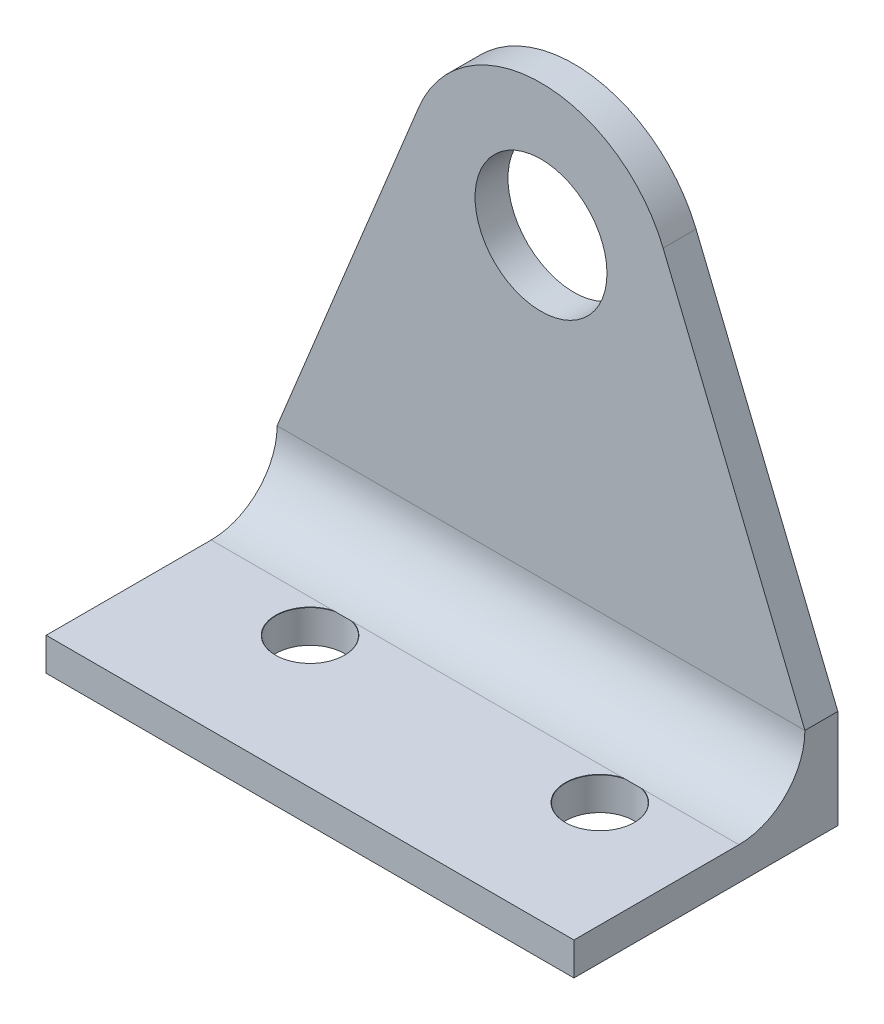
ISO-10303-21;
HEADER;
FILE_DESCRIPTION(('STEP AP214'),'2;1');
FILE_NAME('part.step','',(''),(''),'','','');
FILE_SCHEMA(('AUTOMOTIVE_DESIGN { 1 0 10303 214 1 1 1 1 }'));
ENDSEC;
DATA;
#1=APPLICATION_CONTEXT('core data for automotive mechanical design processes');
#2=APPLICATION_PROTOCOL_DEFINITION('international standard','automotive_design',2000,#1);
#3=PRODUCT_CONTEXT('',#1,'mechanical');
#4=PRODUCT('Part','Part','',(#3));
#5=PRODUCT_RELATED_PRODUCT_CATEGORY('part','',(#4));
#6=PRODUCT_DEFINITION_FORMATION('','',#4);
#7=PRODUCT_DEFINITION_CONTEXT('part definition',#1,'design');
#8=PRODUCT_DEFINITION('design','',#6,#7);
#9=PRODUCT_DEFINITION_SHAPE('','',#8);
#10=(LENGTH_UNIT() NAMED_UNIT(*) SI_UNIT(.MILLI.,.METRE.));
#11=(NAMED_UNIT(*) PLANE_ANGLE_UNIT() SI_UNIT($,.RADIAN.));
#12=(NAMED_UNIT(*) SI_UNIT($,.STERADIAN.) SOLID_ANGLE_UNIT());
#13=UNCERTAINTY_MEASURE_WITH_UNIT(LENGTH_MEASURE(1.E-05),#10,'distance_accuracy_value','');
#14=(GEOMETRIC_REPRESENTATION_CONTEXT(3) GLOBAL_UNCERTAINTY_ASSIGNED_CONTEXT((#13)) GLOBAL_UNIT_ASSIGNED_CONTEXT((#10,
#11,#12)) REPRESENTATION_CONTEXT('',''));
#15=CARTESIAN_POINT('',(0.,0.,0.));
#16=DIRECTION('',(0.,0.,1.));
#17=DIRECTION('',(1.,0.,0.));
#18=AXIS2_PLACEMENT_3D('',#15,#16,#17);
#19=CARTESIAN_POINT('',(25.4,-3.17,-25.4));
#20=DIRECTION('',(0.,0.,1.));
#21=DIRECTION('',(1.,0.,0.));
#22=AXIS2_PLACEMENT_3D('',#19,#20,#21);
#23=PLANE('',#22);
#24=CARTESIAN_POINT('',(0.,34.93,-25.4));
#25=DIRECTION('',(0.,0.,1.));
#26=DIRECTION('',(1.,0.,0.));
#27=AXIS2_PLACEMENT_3D('',#24,#25,#26);
#28=CIRCLE('',#27,6.35);
#29=CARTESIAN_POINT('',(6.35,34.93,-25.4));
#30=VERTEX_POINT('',#29);
#31=EDGE_CURVE('E291',#30,#30,#28,.T.);
#32=ORIENTED_EDGE('',*,*,#31,.T.);
#33=EDGE_LOOP('',(#32));
#34=FACE_BOUND('',#33,.T.);
#35=DIRECTION('',(0.378313744263215,0.925677433505618,0.));
#36=VECTOR('',#35,1.);
#37=CARTESIAN_POINT('',(-23.9884670055434,9.80381118035179,-25.4));
#38=LINE('',#37,#36);
#39=CARTESIAN_POINT('',(-25.4,6.35,-25.4));
#40=VERTEX_POINT('',#39);
#41=CARTESIAN_POINT('',(-11.7561034055213,39.7345845521428,-25.4));
#42=VERTEX_POINT('',#41);
#43=EDGE_CURVE('E173',#40,#42,#38,.T.);
#44=ORIENTED_EDGE('',*,*,#43,.T.);
#45=CARTESIAN_POINT('',(0.,34.93,-25.4));
#46=DIRECTION('',(0.,0.,1.));
#47=DIRECTION('',(1.,0.,0.));
#48=AXIS2_PLACEMENT_3D('',#45,#46,#47);
#49=CIRCLE('',#48,12.7);
#50=CARTESIAN_POINT('',(11.7561034055213,39.7345845521428,-25.4));
#51=VERTEX_POINT('',#50);
#52=EDGE_CURVE('E307',#51,#42,#49,.T.);
#53=ORIENTED_EDGE('',*,*,#52,.F.);
#54=DIRECTION('',(-0.378313744263215,0.925677433505618,0.));
#55=VECTOR('',#54,1.);
#56=CARTESIAN_POINT('',(23.9884670055434,9.8038111803518,-25.4));
#57=LINE('',#56,#55);
#58=CARTESIAN_POINT('',(25.4,6.35,-25.4));
#59=VERTEX_POINT('',#58);
#60=EDGE_CURVE('E299',#59,#51,#57,.T.);
#61=ORIENTED_EDGE('',*,*,#60,.F.);
#62=DIRECTION('',(0.,1.,0.));
#63=VECTOR('',#62,1.);
#64=CARTESIAN_POINT('',(25.4,-3.17,-25.4));
#65=LINE('',#64,#63);
#66=CARTESIAN_POINT('',(25.4,-3.17,-25.4));
#67=VERTEX_POINT('',#66);
#68=EDGE_CURVE('E243',#67,#59,#65,.T.);
#69=ORIENTED_EDGE('',*,*,#68,.F.);
#70=DIRECTION('',(-1.,0.,0.));
#71=VECTOR('',#70,1.);
#72=CARTESIAN_POINT('',(25.4,-3.17,-25.4));
#73=LINE('',#72,#71);
#74=CARTESIAN_POINT('',(-25.4,-3.17,-25.4));
#75=VERTEX_POINT('',#74);
#76=EDGE_CURVE('E200',#67,#75,#73,.T.);
#77=ORIENTED_EDGE('',*,*,#76,.T.);
#78=DIRECTION('',(0.,1.,0.));
#79=VECTOR('',#78,1.);
#80=CARTESIAN_POINT('',(-25.4,-3.17,-25.4));
#81=LINE('',#80,#79);
#82=EDGE_CURVE('E191',#75,#40,#81,.T.);
#83=ORIENTED_EDGE('',*,*,#82,.T.);
#84=EDGE_LOOP('',(#44,#53,#61,#69,#77,#83));
#85=FACE_BOUND('',#84,.T.);
#86=ADVANCED_FACE('F96',(#34,#85),#23,.F.);
#87=CARTESIAN_POINT('',(25.4,0.,-22.23));
#88=DIRECTION('',(0.,0.,-1.));
#89=DIRECTION('',(-1.,0.,0.));
#90=AXIS2_PLACEMENT_3D('',#87,#88,#89);
#91=PLANE('',#90);
#92=CARTESIAN_POINT('',(0.,34.93,-22.23));
#93=DIRECTION('',(0.,0.,1.));
#94=DIRECTION('',(1.,0.,0.));
#95=AXIS2_PLACEMENT_3D('',#92,#93,#94);
#96=CIRCLE('',#95,6.35);
#97=CARTESIAN_POINT('',(6.35,34.93,-22.23));
#98=VERTEX_POINT('',#97);
#99=EDGE_CURVE('E287',#98,#98,#96,.T.);
#100=ORIENTED_EDGE('',*,*,#99,.F.);
#101=EDGE_LOOP('',(#100));
#102=FACE_BOUND('',#101,.T.);
#103=CARTESIAN_POINT('',(0.,34.93,-22.23));
#104=DIRECTION('',(0.,0.,1.));
#105=DIRECTION('',(1.,0.,0.));
#106=AXIS2_PLACEMENT_3D('',#103,#104,#105);
#107=CIRCLE('',#106,12.7);
#108=CARTESIAN_POINT('',(11.7561034055213,39.7345845521428,-22.23));
#109=VERTEX_POINT('',#108);
#110=CARTESIAN_POINT('',(-11.7561034055213,39.7345845521428,-22.23));
#111=VERTEX_POINT('',#110);
#112=EDGE_CURVE('E308',#109,#111,#107,.T.);
#113=ORIENTED_EDGE('',*,*,#112,.T.);
#114=DIRECTION('',(0.378313744263215,0.925677433505618,0.));
#115=VECTOR('',#114,1.);
#116=CARTESIAN_POINT('',(-23.9884670055434,9.80381118035179,-22.23));
#117=LINE('',#116,#115);
#118=CARTESIAN_POINT('',(-25.4,6.35,-22.23));
#119=VERTEX_POINT('',#118);
#120=EDGE_CURVE('E185',#119,#111,#117,.T.);
#121=ORIENTED_EDGE('',*,*,#120,.F.);
#122=DIRECTION('',(-1.,0.,0.));
#123=VECTOR('',#122,1.);
#124=CARTESIAN_POINT('',(25.4,6.35,-22.23));
#125=LINE('',#124,#123);
#126=CARTESIAN_POINT('',(25.4,6.35,-22.23));
#127=VERTEX_POINT('',#126);
#128=EDGE_CURVE('E229',#119,#127,#125,.F.);
#129=ORIENTED_EDGE('',*,*,#128,.T.);
#130=DIRECTION('',(-0.378313744263215,0.925677433505618,0.));
#131=VECTOR('',#130,1.);
#132=CARTESIAN_POINT('',(23.9884670055434,9.8038111803518,-22.23));
#133=LINE('',#132,#131);
#134=EDGE_CURVE('E303',#127,#109,#133,.T.);
#135=ORIENTED_EDGE('',*,*,#134,.T.);
#136=EDGE_LOOP('',(#113,#121,#129,#135));
#137=FACE_BOUND('',#136,.T.);
#138=ADVANCED_FACE('F319',(#102,#137),#91,.F.);
#139=CARTESIAN_POINT('',(25.4,0.,0.));
#140=DIRECTION('',(-1.,0.,0.));
#141=DIRECTION('',(0.,0.,1.));
#142=AXIS2_PLACEMENT_3D('',#139,#140,#141);
#143=PLANE('',#142);
#144=DIRECTION('',(0.,0.,1.));
#145=VECTOR('',#144,1.);
#146=CARTESIAN_POINT('',(25.4,6.35,-25.4));
#147=LINE('',#146,#145);
#148=EDGE_CURVE('E292',#59,#127,#147,.T.);
#149=ORIENTED_EDGE('',*,*,#148,.T.);
#150=CARTESIAN_POINT('',(25.4,6.35,-15.88));
#151=DIRECTION('',(-1.,0.,0.));
#152=DIRECTION('',(0.,0.,1.));
#153=AXIS2_PLACEMENT_3D('',#150,#151,#152);
#154=CIRCLE('',#153,6.35);
#155=CARTESIAN_POINT('',(25.4,0.,-15.88));
#156=VERTEX_POINT('',#155);
#157=EDGE_CURVE('E12',#127,#156,#154,.T.);
#158=ORIENTED_EDGE('',*,*,#157,.T.);
#159=DIRECTION('',(0.,0.,1.));
#160=VECTOR('',#159,1.);
#161=CARTESIAN_POINT('',(25.4,0.,0.));
#162=LINE('',#161,#160);
#163=CARTESIAN_POINT('',(25.4,0.,0.));
#164=VERTEX_POINT('',#163);
#165=EDGE_CURVE('E217',#156,#164,#162,.T.);
#166=ORIENTED_EDGE('',*,*,#165,.T.);
#167=DIRECTION('',(0.,-1.,0.));
#168=VECTOR('',#167,1.);
#169=CARTESIAN_POINT('',(25.4,-3.17,0.));
#170=LINE('',#169,#168);
#171=CARTESIAN_POINT('',(25.4,-3.17,0.));
#172=VERTEX_POINT('',#171);
#173=EDGE_CURVE('E207',#164,#172,#170,.T.);
#174=ORIENTED_EDGE('',*,*,#173,.T.);
#175=DIRECTION('',(0.,0.,-1.));
#176=VECTOR('',#175,1.);
#177=CARTESIAN_POINT('',(25.4,-3.17,0.));
#178=LINE('',#177,#176);
#179=EDGE_CURVE('E247',#172,#67,#178,.T.);
#180=ORIENTED_EDGE('',*,*,#179,.T.);
#181=ORIENTED_EDGE('',*,*,#68,.T.);
#182=EDGE_LOOP('',(#149,#158,#166,#174,#180,#181));
#183=FACE_BOUND('',#182,.T.);
#184=ADVANCED_FACE('F327',(#183),#143,.F.);
#185=CARTESIAN_POINT('',(25.4,-3.17,0.));
#186=DIRECTION('',(0.,0.,-1.));
#187=DIRECTION('',(-1.,0.,0.));
#188=AXIS2_PLACEMENT_3D('',#185,#186,#187);
#189=PLANE('',#188);
#190=DIRECTION('',(0.,-1.,0.));
#191=VECTOR('',#190,1.);
#192=CARTESIAN_POINT('',(-25.4,-3.17,0.));
#193=LINE('',#192,#191);
#194=CARTESIAN_POINT('',(-25.4,0.,0.));
#195=VERTEX_POINT('',#194);
#196=CARTESIAN_POINT('',(-25.4,-3.17,0.));
#197=VERTEX_POINT('',#196);
#198=EDGE_CURVE('E209',#195,#197,#193,.T.);
#199=ORIENTED_EDGE('',*,*,#198,.T.);
#200=DIRECTION('',(-1.,0.,0.));
#201=VECTOR('',#200,1.);
#202=CARTESIAN_POINT('',(25.4,-3.17,0.));
#203=LINE('',#202,#201);
#204=EDGE_CURVE('E220',#172,#197,#203,.T.);
#205=ORIENTED_EDGE('',*,*,#204,.F.);
#206=ORIENTED_EDGE('',*,*,#173,.F.);
#207=DIRECTION('',(-1.,0.,0.));
#208=VECTOR('',#207,1.);
#209=CARTESIAN_POINT('',(25.4,0.,0.));
#210=LINE('',#209,#208);
#211=EDGE_CURVE('E213',#164,#195,#210,.T.);
#212=ORIENTED_EDGE('',*,*,#211,.T.);
#213=EDGE_LOOP('',(#199,#205,#206,#212));
#214=FACE_BOUND('',#213,.T.);
#215=ADVANCED_FACE('F336',(#214),#189,.F.);
#216=CARTESIAN_POINT('',(25.4,-3.17,0.));
#217=DIRECTION('',(0.,1.,0.));
#218=DIRECTION('',(0.,0.,1.));
#219=AXIS2_PLACEMENT_3D('',#216,#217,#218);
#220=PLANE('',#219);
#221=CARTESIAN_POINT('',(-12.7,-3.17,-12.7));
#222=DIRECTION('',(0.,1.,0.));
#223=DIRECTION('',(0.,0.,1.));
#224=AXIS2_PLACEMENT_3D('',#221,#222,#223);
#225=CIRCLE('',#224,3.3);
#226=CARTESIAN_POINT('',(-12.7,-3.17,-9.4));
#227=VERTEX_POINT('',#226);
#228=EDGE_CURVE('E276',#227,#227,#225,.T.);
#229=ORIENTED_EDGE('',*,*,#228,.T.);
#230=EDGE_LOOP('',(#229));
#231=FACE_BOUND('',#230,.T.);
#232=CARTESIAN_POINT('',(15.1908079041927,-3.17,-12.7));
#233=DIRECTION('',(0.,1.,0.));
#234=DIRECTION('',(0.,0.,1.));
#235=AXIS2_PLACEMENT_3D('',#232,#233,#234);
#236=CIRCLE('',#235,3.3);
#237=CARTESIAN_POINT('',(15.1908079041927,-3.17,-9.4));
#238=VERTEX_POINT('',#237);
#239=EDGE_CURVE('E257',#238,#238,#236,.T.);
#240=ORIENTED_EDGE('',*,*,#239,.T.);
#241=EDGE_LOOP('',(#240));
#242=FACE_BOUND('',#241,.T.);
#243=DIRECTION('',(0.,0.,-1.));
#244=VECTOR('',#243,1.);
#245=CARTESIAN_POINT('',(-25.4,-3.17,0.));
#246=LINE('',#245,#244);
#247=EDGE_CURVE('E203',#197,#75,#246,.T.);
#248=ORIENTED_EDGE('',*,*,#247,.T.);
#249=ORIENTED_EDGE('',*,*,#76,.F.);
#250=ORIENTED_EDGE('',*,*,#179,.F.);
#251=ORIENTED_EDGE('',*,*,#204,.T.);
#252=EDGE_LOOP('',(#248,#249,#250,#251));
#253=FACE_BOUND('',#252,.T.);
#254=ADVANCED_FACE('F329',(#231,#242,#253),#220,.F.);
#255=CARTESIAN_POINT('',(25.4,0.,0.));
#256=DIRECTION('',(0.,-1.,0.));
#257=DIRECTION('',(0.,0.,-1.));
#258=AXIS2_PLACEMENT_3D('',#255,#256,#257);
#259=PLANE('',#258);
#260=DIRECTION('',(-1.,0.,0.));
#261=VECTOR('',#260,1.);
#262=CARTESIAN_POINT('',(-25.4,0.,-15.88));
#263=LINE('',#262,#261);
#264=CARTESIAN_POINT('',(14.2196101900274,0.,-15.88));
#265=VERTEX_POINT('',#264);
#266=CARTESIAN_POINT('',(-11.7288022858346,0.,-15.88));
#267=VERTEX_POINT('',#266);
#268=EDGE_CURVE('E236',#265,#267,#263,.T.);
#269=ORIENTED_EDGE('',*,*,#268,.T.);
#270=CARTESIAN_POINT('',(-12.7,0.,-12.7));
#271=DIRECTION('',(0.,1.,0.));
#272=DIRECTION('',(0.,0.,1.));
#273=AXIS2_PLACEMENT_3D('',#270,#271,#272);
#274=CIRCLE('',#273,3.325);
#275=CARTESIAN_POINT('',(-13.6711977141654,0.,-15.88));
#276=VERTEX_POINT('',#275);
#277=EDGE_CURVE('E286',#276,#267,#274,.T.);
#278=ORIENTED_EDGE('',*,*,#277,.F.);
#279=CARTESIAN_POINT('',(-25.4,0.,-15.88));
#280=VERTEX_POINT('',#279);
#281=EDGE_CURVE('E224',#276,#280,#263,.T.);
#282=ORIENTED_EDGE('',*,*,#281,.T.);
#283=DIRECTION('',(0.,0.,1.));
#284=VECTOR('',#283,1.);
#285=CARTESIAN_POINT('',(-25.4,0.,0.));
#286=LINE('',#285,#284);
#287=EDGE_CURVE('E202',#280,#195,#286,.T.);
#288=ORIENTED_EDGE('',*,*,#287,.T.);
#289=ORIENTED_EDGE('',*,*,#211,.F.);
#290=ORIENTED_EDGE('',*,*,#165,.F.);
#291=CARTESIAN_POINT('',(16.1620056183581,0.,-15.88));
#292=VERTEX_POINT('',#291);
#293=EDGE_CURVE('E225',#156,#292,#263,.T.);
#294=ORIENTED_EDGE('',*,*,#293,.T.);
#295=CARTESIAN_POINT('',(15.1908079041927,0.,-12.7));
#296=DIRECTION('',(0.,1.,0.));
#297=DIRECTION('',(0.,0.,1.));
#298=AXIS2_PLACEMENT_3D('',#295,#296,#297);
#299=CIRCLE('',#298,3.325);
#300=EDGE_CURVE('E273',#265,#292,#299,.T.);
#301=ORIENTED_EDGE('',*,*,#300,.F.);
#302=EDGE_LOOP('',(#269,#278,#282,#288,#289,#290,#294,#301));
#303=FACE_BOUND('',#302,.T.);
#304=ADVANCED_FACE('F332',(#303),#259,.F.);
#305=CARTESIAN_POINT('',(-25.4,0.,0.));
#306=DIRECTION('',(-1.,0.,0.));
#307=DIRECTION('',(0.,0.,1.));
#308=AXIS2_PLACEMENT_3D('',#305,#306,#307);
#309=PLANE('',#308);
#310=DIRECTION('',(0.,0.,1.));
#311=VECTOR('',#310,1.);
#312=CARTESIAN_POINT('',(-25.4,6.35,-25.4));
#313=LINE('',#312,#311);
#314=EDGE_CURVE('E177',#40,#119,#313,.T.);
#315=ORIENTED_EDGE('',*,*,#314,.F.);
#316=ORIENTED_EDGE('',*,*,#82,.F.);
#317=ORIENTED_EDGE('',*,*,#247,.F.);
#318=ORIENTED_EDGE('',*,*,#198,.F.);
#319=ORIENTED_EDGE('',*,*,#287,.F.);
#320=CARTESIAN_POINT('',(-25.4,6.35,-15.88));
#321=DIRECTION('',(-1.,0.,0.));
#322=DIRECTION('',(0.,0.,1.));
#323=AXIS2_PLACEMENT_3D('',#320,#321,#322);
#324=CIRCLE('',#323,6.35);
#325=EDGE_CURVE('E105',#280,#119,#324,.F.);
#326=ORIENTED_EDGE('',*,*,#325,.T.);
#327=EDGE_LOOP('',(#315,#316,#317,#318,#319,#326));
#328=FACE_BOUND('',#327,.T.);
#329=ADVANCED_FACE('F190',(#328),#309,.T.);
#330=CARTESIAN_POINT('',(25.4,6.35,-15.88));
#331=DIRECTION('',(1.,0.,0.));
#332=DIRECTION('',(0.,0.,-1.));
#333=AXIS2_PLACEMENT_3D('',#330,#331,#332);
#334=CYLINDRICAL_SURFACE('',#333,6.35);
#335=ORIENTED_EDGE('',*,*,#157,.F.);
#336=ORIENTED_EDGE('',*,*,#128,.F.);
#337=ORIENTED_EDGE('',*,*,#325,.F.);
#338=ORIENTED_EDGE('',*,*,#281,.F.);
#339=EDGE_CURVE('E239',#267,#276,#263,.T.);
#340=ORIENTED_EDGE('',*,*,#339,.F.);
#341=ORIENTED_EDGE('',*,*,#268,.F.);
#342=EDGE_CURVE('E230',#292,#265,#263,.T.);
#343=ORIENTED_EDGE('',*,*,#342,.F.);
#344=ORIENTED_EDGE('',*,*,#293,.F.);
#345=EDGE_LOOP('',(#335,#336,#337,#338,#340,#341,#343,#344));
#346=FACE_BOUND('',#345,.T.);
#347=ADVANCED_FACE('F98',(#346),#334,.F.);
#348=CARTESIAN_POINT('',(18.5158079041927,0.,-12.7));
#349=DIRECTION('',(0.,1.,0.));
#350=DIRECTION('',(0.,0.,1.));
#351=AXIS2_PLACEMENT_3D('',#348,#349,#350);
#352=PLANE('',#351);
#353=ORIENTED_EDGE('',*,*,#342,.T.);
#354=EDGE_CURVE('E118',#292,#265,#299,.T.);
#355=ORIENTED_EDGE('',*,*,#354,.F.);
#356=EDGE_LOOP('',(#353,#355));
#357=FACE_BOUND('',#356,.T.);
#358=ADVANCED_FACE('F360',(#357),#352,.F.);
#359=CARTESIAN_POINT('',(15.1908079041927,0.,-12.7));
#360=DIRECTION('',(0.,1.,0.));
#361=DIRECTION('',(0.,0.,1.));
#362=AXIS2_PLACEMENT_3D('',#359,#360,#361);
#363=CYLINDRICAL_SURFACE('',#362,3.3);
#364=ORIENTED_EDGE('',*,*,#239,.F.);
#365=EDGE_LOOP('',(#364));
#366=FACE_BOUND('',#365,.T.);
#367=CARTESIAN_POINT('',(15.1908079041927,-0.0250000000000007,-12.7));
#368=DIRECTION('',(0.,1.,0.));
#369=DIRECTION('',(0.,0.,1.));
#370=AXIS2_PLACEMENT_3D('',#367,#368,#369);
#371=CIRCLE('',#370,3.3);
#372=CARTESIAN_POINT('',(15.1908079041927,-0.0250000000000007,-9.4));
#373=VERTEX_POINT('',#372);
#374=EDGE_CURVE('E265',#373,#373,#371,.T.);
#375=ORIENTED_EDGE('',*,*,#374,.T.);
#376=EDGE_LOOP('',(#375));
#377=FACE_BOUND('',#376,.T.);
#378=ADVANCED_FACE('F363',(#366,#377),#363,.F.);
#379=CARTESIAN_POINT('',(15.1908079041927,0.,-12.7));
#380=DIRECTION('',(0.,1.,0.));
#381=DIRECTION('',(0.,0.,1.));
#382=AXIS2_PLACEMENT_3D('',#379,#380,#381);
#383=CONICAL_SURFACE('',#382,3.325,0.785398163397448);
#384=ORIENTED_EDGE('',*,*,#374,.F.);
#385=EDGE_LOOP('',(#384));
#386=FACE_BOUND('',#385,.T.);
#387=ORIENTED_EDGE('',*,*,#354,.T.);
#388=ORIENTED_EDGE('',*,*,#300,.T.);
#389=EDGE_LOOP('',(#387,#388));
#390=FACE_BOUND('',#389,.T.);
#391=ADVANCED_FACE('F366',(#386,#390),#383,.F.);
#392=CARTESIAN_POINT('',(-9.375,0.,-12.7));
#393=DIRECTION('',(0.,1.,0.));
#394=DIRECTION('',(0.,0.,1.));
#395=AXIS2_PLACEMENT_3D('',#392,#393,#394);
#396=PLANE('',#395);
#397=ORIENTED_EDGE('',*,*,#339,.T.);
#398=EDGE_CURVE('E111',#267,#276,#274,.T.);
#399=ORIENTED_EDGE('',*,*,#398,.F.);
#400=EDGE_LOOP('',(#397,#399));
#401=FACE_BOUND('',#400,.T.);
#402=ADVANCED_FACE('F370',(#401),#396,.F.);
#403=CARTESIAN_POINT('',(-12.7,0.,-12.7));
#404=DIRECTION('',(0.,1.,0.));
#405=DIRECTION('',(0.,0.,1.));
#406=AXIS2_PLACEMENT_3D('',#403,#404,#405);
#407=CYLINDRICAL_SURFACE('',#406,3.3);
#408=ORIENTED_EDGE('',*,*,#228,.F.);
#409=EDGE_LOOP('',(#408));
#410=FACE_BOUND('',#409,.T.);
#411=CARTESIAN_POINT('',(-12.7,-0.0250000000000007,-12.7));
#412=DIRECTION('',(0.,1.,0.));
#413=DIRECTION('',(0.,0.,1.));
#414=AXIS2_PLACEMENT_3D('',#411,#412,#413);
#415=CIRCLE('',#414,3.3);
#416=CARTESIAN_POINT('',(-12.7,-0.0250000000000007,-9.4));
#417=VERTEX_POINT('',#416);
#418=EDGE_CURVE('E280',#417,#417,#415,.T.);
#419=ORIENTED_EDGE('',*,*,#418,.T.);
#420=EDGE_LOOP('',(#419));
#421=FACE_BOUND('',#420,.T.);
#422=ADVANCED_FACE('F374',(#410,#421),#407,.F.);
#423=CARTESIAN_POINT('',(-12.7,0.,-12.7));
#424=DIRECTION('',(0.,1.,0.));
#425=DIRECTION('',(0.,0.,1.));
#426=AXIS2_PLACEMENT_3D('',#423,#424,#425);
#427=CONICAL_SURFACE('',#426,3.325,0.785398163397414);
#428=ORIENTED_EDGE('',*,*,#418,.F.);
#429=EDGE_LOOP('',(#428));
#430=FACE_BOUND('',#429,.T.);
#431=ORIENTED_EDGE('',*,*,#398,.T.);
#432=ORIENTED_EDGE('',*,*,#277,.T.);
#433=EDGE_LOOP('',(#431,#432));
#434=FACE_BOUND('',#433,.T.);
#435=ADVANCED_FACE('F378',(#430,#434),#427,.F.);
#436=CARTESIAN_POINT('',(0.,34.93,-25.4));
#437=DIRECTION('',(0.,0.,1.));
#438=DIRECTION('',(1.,0.,0.));
#439=AXIS2_PLACEMENT_3D('',#436,#437,#438);
#440=CYLINDRICAL_SURFACE('',#439,12.7);
#441=ORIENTED_EDGE('',*,*,#112,.F.);
#442=DIRECTION('',(0.,0.,1.));
#443=VECTOR('',#442,1.);
#444=CARTESIAN_POINT('',(11.7561034055213,39.7345845521428,-25.4));
#445=LINE('',#444,#443);
#446=EDGE_CURVE('E296',#51,#109,#445,.T.);
#447=ORIENTED_EDGE('',*,*,#446,.F.);
#448=ORIENTED_EDGE('',*,*,#52,.T.);
#449=DIRECTION('',(0.,0.,1.));
#450=VECTOR('',#449,1.);
#451=CARTESIAN_POINT('',(-11.7561034055213,39.7345845521428,-25.4));
#452=LINE('',#451,#450);
#453=EDGE_CURVE('E180',#42,#111,#452,.T.);
#454=ORIENTED_EDGE('',*,*,#453,.T.);
#455=EDGE_LOOP('',(#441,#447,#448,#454));
#456=FACE_BOUND('',#455,.T.);
#457=ADVANCED_FACE('F324',(#456),#440,.T.);
#458=CARTESIAN_POINT('',(23.9884670055434,9.8038111803518,-25.4));
#459=DIRECTION('',(0.925677433505617,0.378313744263215,0.));
#460=DIRECTION('',(-0.378313744263215,0.925677433505618,0.));
#461=AXIS2_PLACEMENT_3D('',#458,#459,#460);
#462=PLANE('',#461);
#463=ORIENTED_EDGE('',*,*,#134,.F.);
#464=ORIENTED_EDGE('',*,*,#148,.F.);
#465=ORIENTED_EDGE('',*,*,#60,.T.);
#466=ORIENTED_EDGE('',*,*,#446,.T.);
#467=EDGE_LOOP('',(#463,#464,#465,#466));
#468=FACE_BOUND('',#467,.T.);
#469=ADVANCED_FACE('F386',(#468),#462,.T.);
#470=CARTESIAN_POINT('',(0.,34.93,-25.4));
#471=DIRECTION('',(0.,0.,1.));
#472=DIRECTION('',(1.,0.,0.));
#473=AXIS2_PLACEMENT_3D('',#470,#471,#472);
#474=CYLINDRICAL_SURFACE('',#473,6.35);
#475=CARTESIAN_POINT('',(6.35,34.93,-25.4));
#476=CARTESIAN_POINT('',(6.35,34.93,-25.3669791666667));
#477=CARTESIAN_POINT('',(6.35,34.93,-25.3339583333333));
#478=CARTESIAN_POINT('',(6.35,34.93,-25.2679166666667));
#479=CARTESIAN_POINT('',(6.35,34.93,-25.2348958333333));
#480=CARTESIAN_POINT('',(6.35,34.93,-25.1688541666667));
#481=CARTESIAN_POINT('',(6.35,34.93,-25.1358333333333));
#482=CARTESIAN_POINT('',(6.35,34.93,-25.0697916666667));
#483=CARTESIAN_POINT('',(6.35,34.93,-25.0367708333333));
#484=CARTESIAN_POINT('',(6.35,34.93,-24.9707291666667));
#485=CARTESIAN_POINT('',(6.35,34.93,-24.9377083333333));
#486=CARTESIAN_POINT('',(6.35,34.93,-24.8716666666667));
#487=CARTESIAN_POINT('',(6.35,34.93,-24.8386458333333));
#488=CARTESIAN_POINT('',(6.35,34.93,-24.7726041666667));
#489=CARTESIAN_POINT('',(6.35,34.93,-24.7395833333333));
#490=CARTESIAN_POINT('',(6.35,34.93,-24.6735416666667));
#491=CARTESIAN_POINT('',(6.35,34.93,-24.6405208333333));
#492=CARTESIAN_POINT('',(6.35,34.93,-24.5744791666667));
#493=CARTESIAN_POINT('',(6.35,34.93,-24.5414583333333));
#494=CARTESIAN_POINT('',(6.35,34.93,-24.4754166666667));
#495=CARTESIAN_POINT('',(6.35,34.93,-24.4423958333333));
#496=CARTESIAN_POINT('',(6.35,34.93,-24.3763541666667));
#497=CARTESIAN_POINT('',(6.35,34.93,-24.3433333333333));
#498=CARTESIAN_POINT('',(6.35,34.93,-24.2772916666667));
#499=CARTESIAN_POINT('',(6.35,34.93,-24.2442708333333));
#500=CARTESIAN_POINT('',(6.35,34.93,-24.1782291666667));
#501=CARTESIAN_POINT('',(6.35,34.93,-24.1452083333333));
#502=CARTESIAN_POINT('',(6.35,34.93,-24.0791666666667));
#503=CARTESIAN_POINT('',(6.35,34.93,-24.0461458333333));
#504=CARTESIAN_POINT('',(6.35,34.93,-23.9801041666667));
#505=CARTESIAN_POINT('',(6.35,34.93,-23.9470833333333));
#506=CARTESIAN_POINT('',(6.35,34.93,-23.8810416666667));
#507=CARTESIAN_POINT('',(6.35,34.93,-23.8480208333333));
#508=CARTESIAN_POINT('',(6.35,34.93,-23.7819791666667));
#509=CARTESIAN_POINT('',(6.35,34.93,-23.7489583333333));
#510=CARTESIAN_POINT('',(6.35,34.93,-23.6829166666667));
#511=CARTESIAN_POINT('',(6.35,34.93,-23.6498958333333));
#512=CARTESIAN_POINT('',(6.35,34.93,-23.5838541666667));
#513=CARTESIAN_POINT('',(6.35,34.93,-23.5508333333333));
#514=CARTESIAN_POINT('',(6.35,34.93,-23.4847916666667));
#515=CARTESIAN_POINT('',(6.35,34.93,-23.4517708333333));
#516=CARTESIAN_POINT('',(6.35,34.93,-23.3857291666667));
#517=CARTESIAN_POINT('',(6.35,34.93,-23.3527083333333));
#518=CARTESIAN_POINT('',(6.35,34.93,-23.2866666666667));
#519=CARTESIAN_POINT('',(6.35,34.93,-23.2536458333333));
#520=CARTESIAN_POINT('',(6.35,34.93,-23.1876041666667));
#521=CARTESIAN_POINT('',(6.35,34.93,-23.1545833333333));
#522=CARTESIAN_POINT('',(6.35,34.93,-23.0885416666667));
#523=CARTESIAN_POINT('',(6.35,34.93,-23.0555208333333));
#524=CARTESIAN_POINT('',(6.35,34.93,-22.9894791666667));
#525=CARTESIAN_POINT('',(6.35,34.93,-22.9564583333333));
#526=CARTESIAN_POINT('',(6.35,34.93,-22.8904166666667));
#527=CARTESIAN_POINT('',(6.35,34.93,-22.8573958333333));
#528=CARTESIAN_POINT('',(6.35,34.93,-22.7913541666667));
#529=CARTESIAN_POINT('',(6.35,34.93,-22.7583333333333));
#530=CARTESIAN_POINT('',(6.35,34.93,-22.6922916666667));
#531=CARTESIAN_POINT('',(6.35,34.93,-22.6592708333333));
#532=CARTESIAN_POINT('',(6.35,34.93,-22.5932291666667));
#533=CARTESIAN_POINT('',(6.35,34.93,-22.5602083333333));
#534=CARTESIAN_POINT('',(6.35,34.93,-22.4941666666667));
#535=CARTESIAN_POINT('',(6.35,34.93,-22.4611458333333));
#536=CARTESIAN_POINT('',(6.35,34.93,-22.3951041666667));
#537=CARTESIAN_POINT('',(6.35,34.93,-22.3620833333333));
#538=CARTESIAN_POINT('',(6.35,34.93,-22.2960416666667));
#539=CARTESIAN_POINT('',(6.35,34.93,-22.2630208333333));
#540=CARTESIAN_POINT('',(6.35,34.93,-22.23));
#541=B_SPLINE_CURVE_WITH_KNOTS('',3,(#475,#476,#477,#478,#479,#480,#481,#482,#483,#484,#485,
#486,#487,#488,#489,#490,#491,#492,#493,#494,#495,#496,#497,#498,#499,#500,#501,#502,#503,#504,
#505,#506,#507,#508,#509,#510,#511,#512,#513,#514,#515,#516,#517,#518,#519,#520,#521,#522,#523,
#524,#525,#526,#527,#528,#529,#530,#531,#532,#533,#534,#535,#536,#537,#538,#539,#540),
.UNSPECIFIED.,.F.,.F.,(4,2,2,2,2,2,2,2,2,2,2,2,2,2,2,2,2,2,2,2,2,2,2,2,2,2,2,2,2,2,2,2,4),(0.,
0.0990625000000002,0.198125,0.297187500000001,0.396250000000001,0.495312500000001,
0.594375000000001,0.693437500000001,0.792500000000002,0.891562500000002,0.990625000000002,
1.0896875,1.18875,1.2878125,1.386875,1.4859375,1.585,1.6840625,1.783125,1.8821875,1.98125,
2.0803125,2.179375,2.2784375,2.3775,2.4765625,2.575625,2.6746875,2.77375,2.8728125,2.971875,
3.0709375,3.17),.UNSPECIFIED.);
#542=EDGE_CURVE('BSEAM383',#30,#98,#541,.T.);
#543=ORIENTED_EDGE('',*,*,#31,.F.);
#544=ORIENTED_EDGE('',*,*,#99,.T.);
#545=ORIENTED_EDGE('',*,*,#542,.T.);
#546=ORIENTED_EDGE('',*,*,#542,.F.);
#547=EDGE_LOOP('',(#543,#545,#544,#546));
#548=FACE_BOUND('',#547,.T.);
#549=ADVANCED_FACE('F383',(#548),#474,.F.);
#550=CARTESIAN_POINT('',(-23.9884670055434,9.80381118035179,-25.4));
#551=DIRECTION('',(0.925677433505618,-0.378313744263215,0.));
#552=DIRECTION('',(0.378313744263215,0.925677433505618,0.));
#553=AXIS2_PLACEMENT_3D('',#550,#551,#552);
#554=PLANE('',#553);
#555=ORIENTED_EDGE('',*,*,#120,.T.);
#556=ORIENTED_EDGE('',*,*,#453,.F.);
#557=ORIENTED_EDGE('',*,*,#43,.F.);
#558=ORIENTED_EDGE('',*,*,#314,.T.);
#559=EDGE_LOOP('',(#555,#556,#557,#558));
#560=FACE_BOUND('',#559,.T.);
#561=ADVANCED_FACE('F176',(#560),#554,.F.);
#562=CLOSED_SHELL('',(#86,#138,#184,#215,#254,#304,#329,#347,#358,#378,#391,#402,#422,#435,#457,
#469,#549,#561));
#563=MANIFOLD_SOLID_BREP('B2',#562);
#564=ADVANCED_BREP_SHAPE_REPRESENTATION('',(#18,#563),#14);
#565=SHAPE_DEFINITION_REPRESENTATION(#9,#564);
ENDSEC;
END-ISO-10303-21;
